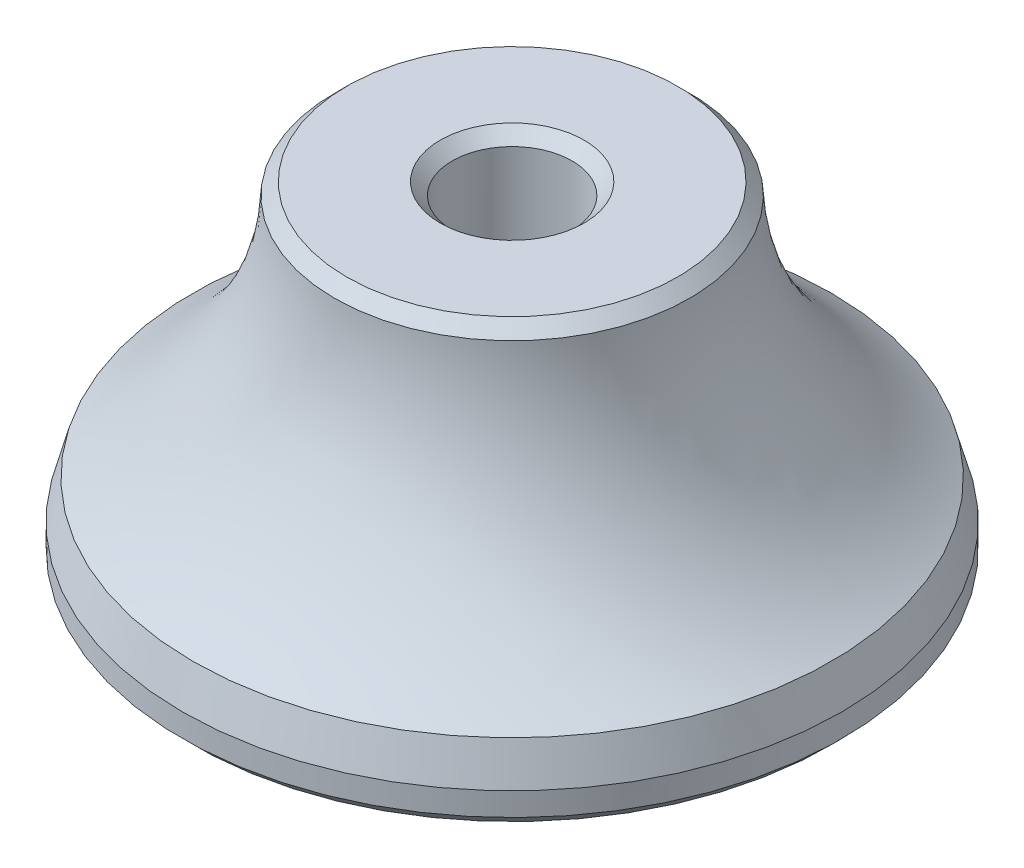
ISO-10303-21;
HEADER;
FILE_DESCRIPTION(('STEP AP214'),'2;1');
FILE_NAME('part.step','',(''),(''),'','','');
FILE_SCHEMA(('AUTOMOTIVE_DESIGN { 1 0 10303 214 1 1 1 1 }'));
ENDSEC;
DATA;
#1=APPLICATION_CONTEXT('core data for automotive mechanical design processes');
#2=APPLICATION_PROTOCOL_DEFINITION('international standard','automotive_design',2000,#1);
#3=PRODUCT_CONTEXT('',#1,'mechanical');
#4=PRODUCT('Part','Part','',(#3));
#5=PRODUCT_RELATED_PRODUCT_CATEGORY('part','',(#4));
#6=PRODUCT_DEFINITION_FORMATION('','',#4);
#7=PRODUCT_DEFINITION_CONTEXT('part definition',#1,'design');
#8=PRODUCT_DEFINITION('design','',#6,#7);
#9=PRODUCT_DEFINITION_SHAPE('','',#8);
#10=(LENGTH_UNIT() NAMED_UNIT(*) SI_UNIT(.MILLI.,.METRE.));
#11=(NAMED_UNIT(*) PLANE_ANGLE_UNIT() SI_UNIT($,.RADIAN.));
#12=(NAMED_UNIT(*) SI_UNIT($,.STERADIAN.) SOLID_ANGLE_UNIT());
#13=UNCERTAINTY_MEASURE_WITH_UNIT(LENGTH_MEASURE(1.E-05),#10,'distance_accuracy_value','');
#14=(GEOMETRIC_REPRESENTATION_CONTEXT(3) GLOBAL_UNCERTAINTY_ASSIGNED_CONTEXT((#13)) GLOBAL_UNIT_ASSIGNED_CONTEXT((#10,
#11,#12)) REPRESENTATION_CONTEXT('',''));
#15=CARTESIAN_POINT('',(0.,0.,0.));
#16=DIRECTION('',(0.,0.,1.));
#17=DIRECTION('',(1.,0.,0.));
#18=AXIS2_PLACEMENT_3D('',#15,#16,#17);
#19=CARTESIAN_POINT('',(0.,0.,0.));
#20=DIRECTION('',(0.,-1.,0.));
#21=DIRECTION('',(0.,0.,-1.));
#22=AXIS2_PLACEMENT_3D('',#19,#20,#21);
#23=TOROIDAL_SURFACE('',#22,25.4,16.002);
#24=CARTESIAN_POINT('',(0.,-13.5617114547127,0.));
#25=DIRECTION('',(0.,1.,0.));
#26=DIRECTION('',(0.,0.,1.));
#27=AXIS2_PLACEMENT_3D('',#24,#25,#26);
#28=CIRCLE('',#27,16.906238382253);
#29=CARTESIAN_POINT('',(0.,-13.5617114547127,16.906238382253));
#30=VERTEX_POINT('',#29);
#31=EDGE_CURVE('E51',#30,#30,#28,.T.);
#32=ORIENTED_EDGE('',*,*,#31,.T.);
#33=EDGE_LOOP('',(#32));
#34=FACE_BOUND('',#33,.T.);
#35=CARTESIAN_POINT('',(0.,-0.64813105515778,0.));
#36=DIRECTION('',(0.,1.,0.));
#37=DIRECTION('',(0.,0.,1.));
#38=AXIS2_PLACEMENT_3D('',#35,#36,#37);
#39=CIRCLE('',#38,9.41113105515778);
#40=CARTESIAN_POINT('',(0.,-0.64813105515778,9.41113105515778));
#41=VERTEX_POINT('',#40);
#42=EDGE_CURVE('E57',#41,#41,#39,.F.);
#43=ORIENTED_EDGE('',*,*,#42,.T.);
#44=EDGE_LOOP('',(#43));
#45=FACE_BOUND('',#44,.T.);
#46=ADVANCED_FACE('F37',(#34,#45),#23,.F.);
#47=CARTESIAN_POINT('',(9.398,0.,0.));
#48=DIRECTION('',(0.,1.,0.));
#49=DIRECTION('',(0.,0.,1.));
#50=AXIS2_PLACEMENT_3D('',#47,#48,#49);
#51=PLANE('',#50);
#52=CARTESIAN_POINT('',(0.,0.,0.));
#53=DIRECTION('',(0.,1.,0.));
#54=DIRECTION('',(0.,0.,1.));
#55=AXIS2_PLACEMENT_3D('',#52,#53,#54);
#56=CIRCLE('',#55,8.76299999999999);
#57=CARTESIAN_POINT('',(0.,0.,8.76299999999999));
#58=VERTEX_POINT('',#57);
#59=EDGE_CURVE('E10',#58,#58,#56,.T.);
#60=ORIENTED_EDGE('',*,*,#59,.T.);
#61=EDGE_LOOP('',(#60));
#62=FACE_BOUND('',#61,.T.);
#63=CARTESIAN_POINT('',(0.,0.,0.));
#64=DIRECTION('',(0.,1.,0.));
#65=DIRECTION('',(0.,0.,1.));
#66=AXIS2_PLACEMENT_3D('',#63,#64,#65);
#67=CIRCLE('',#66,3.81000000000002);
#68=CARTESIAN_POINT('',(0.,0.,3.81000000000002));
#69=VERTEX_POINT('',#68);
#70=EDGE_CURVE('E45',#69,#69,#67,.F.);
#71=ORIENTED_EDGE('',*,*,#70,.T.);
#72=EDGE_LOOP('',(#71));
#73=FACE_BOUND('',#72,.T.);
#74=ADVANCED_FACE('F108',(#62,#73),#51,.T.);
#75=CARTESIAN_POINT('',(0.,-17.4625,0.));
#76=DIRECTION('',(0.,-1.,0.));
#77=DIRECTION('',(0.,0.,-1.));
#78=AXIS2_PLACEMENT_3D('',#75,#76,#77);
#79=PLANE('',#78);
#80=CARTESIAN_POINT('',(0.,-17.4625,0.));
#81=DIRECTION('',(0.,-1.,0.));
#82=DIRECTION('',(0.,0.,-1.));
#83=AXIS2_PLACEMENT_3D('',#80,#81,#82);
#84=CIRCLE('',#83,16.8275);
#85=CARTESIAN_POINT('',(0.,-17.4625,-16.8275));
#86=VERTEX_POINT('',#85);
#87=EDGE_CURVE('E77',#86,#86,#84,.T.);
#88=ORIENTED_EDGE('',*,*,#87,.T.);
#89=EDGE_LOOP('',(#88));
#90=FACE_BOUND('',#89,.T.);
#91=CARTESIAN_POINT('',(0.,-17.4625,0.));
#92=DIRECTION('',(0.,-1.,0.));
#93=DIRECTION('',(0.,0.,-1.));
#94=AXIS2_PLACEMENT_3D('',#91,#92,#93);
#95=CIRCLE('',#94,3.81000000000001);
#96=CARTESIAN_POINT('',(0.,-17.4625,-3.81000000000001));
#97=VERTEX_POINT('',#96);
#98=EDGE_CURVE('E81',#97,#97,#95,.F.);
#99=ORIENTED_EDGE('',*,*,#98,.T.);
#100=EDGE_LOOP('',(#99));
#101=FACE_BOUND('',#100,.T.);
#102=ADVANCED_FACE('F88',(#90,#101),#79,.T.);
#103=CARTESIAN_POINT('',(0.,0.,0.));
#104=DIRECTION('',(0.,-1.,0.));
#105=DIRECTION('',(0.,0.,-1.));
#106=AXIS2_PLACEMENT_3D('',#103,#104,#105);
#107=CYLINDRICAL_SURFACE('',#106,17.4625);
#108=CARTESIAN_POINT('',(0.,-16.8275,0.));
#109=DIRECTION('',(0.,-1.,0.));
#110=DIRECTION('',(0.,0.,-1.));
#111=AXIS2_PLACEMENT_3D('',#108,#109,#110);
#112=CIRCLE('',#111,17.4625);
#113=CARTESIAN_POINT('',(0.,-16.8275,-17.4625));
#114=VERTEX_POINT('',#113);
#115=EDGE_CURVE('E69',#114,#114,#112,.F.);
#116=ORIENTED_EDGE('',*,*,#115,.T.);
#117=EDGE_LOOP('',(#116));
#118=FACE_BOUND('',#117,.T.);
#119=CARTESIAN_POINT('',(0.,-15.6003458917324,0.));
#120=DIRECTION('',(0.,1.,0.));
#121=DIRECTION('',(0.,0.,1.));
#122=AXIS2_PLACEMENT_3D('',#119,#120,#121);
#123=CIRCLE('',#122,17.4625);
#124=CARTESIAN_POINT('',(0.,-15.6003458917324,17.4625));
#125=VERTEX_POINT('',#124);
#126=EDGE_CURVE('E73',#125,#125,#123,.F.);
#127=ORIENTED_EDGE('',*,*,#126,.T.);
#128=EDGE_LOOP('',(#127));
#129=FACE_BOUND('',#128,.T.);
#130=ADVANCED_FACE('F119',(#118,#129),#107,.T.);
#131=CARTESIAN_POINT('',(0.,-17.4625,0.));
#132=DIRECTION('',(0.,1.,0.));
#133=DIRECTION('',(0.,0.,1.));
#134=AXIS2_PLACEMENT_3D('',#131,#132,#133);
#135=CYLINDRICAL_SURFACE('',#134,3.175);
#136=CARTESIAN_POINT('',(0.,-16.8275,0.));
#137=DIRECTION('',(0.,-1.,0.));
#138=DIRECTION('',(0.,0.,-1.));
#139=AXIS2_PLACEMENT_3D('',#136,#137,#138);
#140=CIRCLE('',#139,3.175);
#141=CARTESIAN_POINT('',(0.,-16.8275,-3.175));
#142=VERTEX_POINT('',#141);
#143=EDGE_CURVE('E62',#142,#142,#140,.T.);
#144=ORIENTED_EDGE('',*,*,#143,.T.);
#145=EDGE_LOOP('',(#144));
#146=FACE_BOUND('',#145,.T.);
#147=CARTESIAN_POINT('',(0.,-0.635000000000011,0.));
#148=DIRECTION('',(0.,1.,0.));
#149=DIRECTION('',(0.,0.,1.));
#150=AXIS2_PLACEMENT_3D('',#147,#148,#149);
#151=CIRCLE('',#150,3.175);
#152=CARTESIAN_POINT('',(0.,-0.635000000000011,3.175));
#153=VERTEX_POINT('',#152);
#154=EDGE_CURVE('E66',#153,#153,#151,.T.);
#155=ORIENTED_EDGE('',*,*,#154,.T.);
#156=EDGE_LOOP('',(#155));
#157=FACE_BOUND('',#156,.T.);
#158=ADVANCED_FACE('F103',(#146,#157),#135,.F.);
#159=CARTESIAN_POINT('',(0.,-17.4625,0.));
#160=DIRECTION('',(0.,1.,0.));
#161=DIRECTION('',(0.,0.,1.));
#162=AXIS2_PLACEMENT_3D('',#159,#160,#161);
#163=CONICAL_SURFACE('',#162,16.8275,0.78539816339744);
#164=ORIENTED_EDGE('',*,*,#115,.F.);
#165=EDGE_LOOP('',(#164));
#166=FACE_BOUND('',#165,.T.);
#167=ORIENTED_EDGE('',*,*,#87,.F.);
#168=EDGE_LOOP('',(#167));
#169=FACE_BOUND('',#168,.T.);
#170=ADVANCED_FACE('F93',(#166,#169),#163,.T.);
#171=CARTESIAN_POINT('',(0.,-17.4625,0.));
#172=DIRECTION('',(0.,-1.,0.));
#173=DIRECTION('',(0.,0.,-1.));
#174=AXIS2_PLACEMENT_3D('',#171,#172,#173);
#175=CONICAL_SURFACE('',#174,3.81000000000001,0.785398163397446);
#176=ORIENTED_EDGE('',*,*,#143,.F.);
#177=EDGE_LOOP('',(#176));
#178=FACE_BOUND('',#177,.T.);
#179=ORIENTED_EDGE('',*,*,#98,.F.);
#180=EDGE_LOOP('',(#179));
#181=FACE_BOUND('',#180,.T.);
#182=ADVANCED_FACE('F90',(#178,#181),#175,.F.);
#183=CARTESIAN_POINT('',(0.,-15.6003458917324,0.));
#184=DIRECTION('',(0.,-1.,0.));
#185=DIRECTION('',(0.,0.,-1.));
#186=AXIS2_PLACEMENT_3D('',#183,#184,#185);
#187=CONICAL_SURFACE('',#186,17.4625,0.266375503675734);
#188=ORIENTED_EDGE('',*,*,#31,.F.);
#189=EDGE_LOOP('',(#188));
#190=FACE_BOUND('',#189,.T.);
#191=ORIENTED_EDGE('',*,*,#126,.F.);
#192=EDGE_LOOP('',(#191));
#193=FACE_BOUND('',#192,.T.);
#194=ADVANCED_FACE('F92',(#190,#193),#187,.T.);
#195=CARTESIAN_POINT('',(0.,-0.648131055157782,0.));
#196=DIRECTION('',(0.,-1.,0.));
#197=DIRECTION('',(0.,0.,-1.));
#198=AXIS2_PLACEMENT_3D('',#195,#196,#197);
#199=CONICAL_SURFACE('',#198,9.41113105515778,0.785398163397453);
#200=ORIENTED_EDGE('',*,*,#59,.F.);
#201=EDGE_LOOP('',(#200));
#202=FACE_BOUND('',#201,.T.);
#203=ORIENTED_EDGE('',*,*,#42,.F.);
#204=EDGE_LOOP('',(#203));
#205=FACE_BOUND('',#204,.T.);
#206=ADVANCED_FACE('F100',(#202,#205),#199,.T.);
#207=CARTESIAN_POINT('',(0.,-0.635000000000011,0.));
#208=DIRECTION('',(0.,1.,0.));
#209=DIRECTION('',(0.,0.,1.));
#210=AXIS2_PLACEMENT_3D('',#207,#208,#209);
#211=CONICAL_SURFACE('',#210,3.175,0.785398163397452);
#212=ORIENTED_EDGE('',*,*,#70,.F.);
#213=EDGE_LOOP('',(#212));
#214=FACE_BOUND('',#213,.T.);
#215=ORIENTED_EDGE('',*,*,#154,.F.);
#216=EDGE_LOOP('',(#215));
#217=FACE_BOUND('',#216,.T.);
#218=ADVANCED_FACE('F39',(#214,#217),#211,.F.);
#219=CLOSED_SHELL('',(#46,#74,#102,#130,#158,#170,#182,#194,#206,#218));
#220=MANIFOLD_SOLID_BREP('B2',#219);
#221=ADVANCED_BREP_SHAPE_REPRESENTATION('',(#18,#220),#14);
#222=SHAPE_DEFINITION_REPRESENTATION(#9,#221);
ENDSEC;
END-ISO-10303-21;
